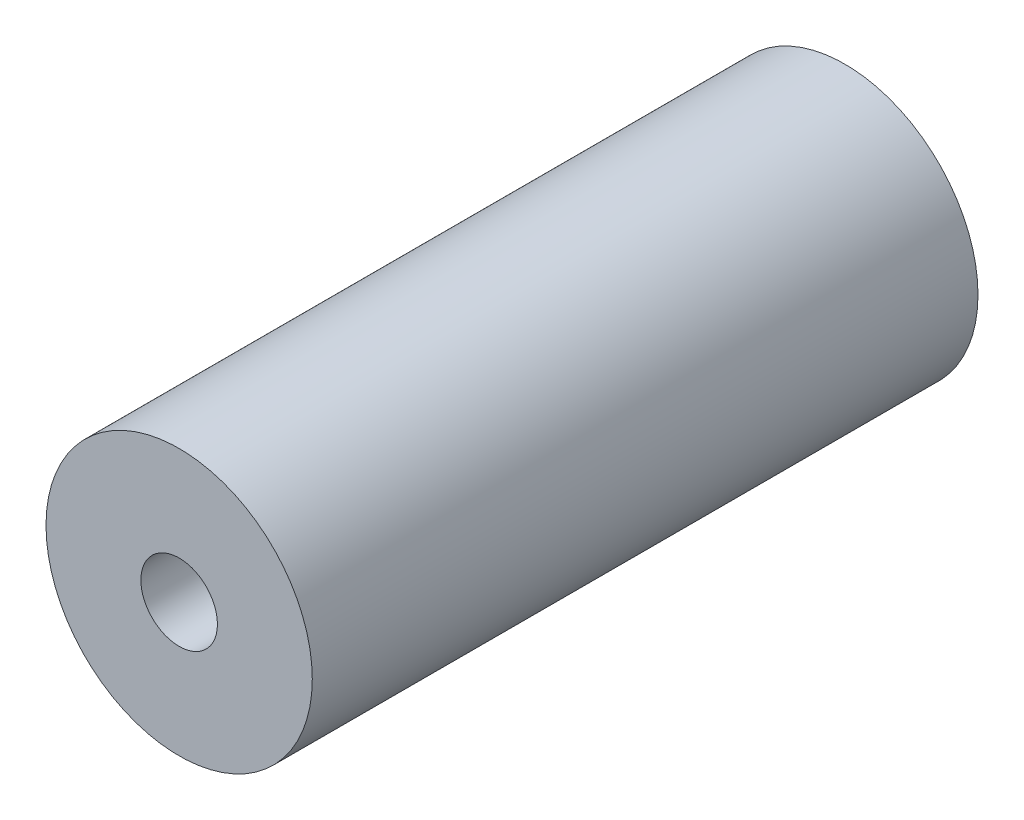
ISO-10303-21;
HEADER;
FILE_DESCRIPTION(('STEP AP214'),'2;1');
FILE_NAME('part.step','',(''),(''),'','','');
FILE_SCHEMA(('AUTOMOTIVE_DESIGN { 1 0 10303 214 1 1 1 1 }'));
ENDSEC;
DATA;
#1=APPLICATION_CONTEXT('core data for automotive mechanical design processes');
#2=APPLICATION_PROTOCOL_DEFINITION('international standard','automotive_design',2000,#1);
#3=PRODUCT_CONTEXT('',#1,'mechanical');
#4=PRODUCT('Part','Part','',(#3));
#5=PRODUCT_RELATED_PRODUCT_CATEGORY('part','',(#4));
#6=PRODUCT_DEFINITION_FORMATION('','',#4);
#7=PRODUCT_DEFINITION_CONTEXT('part definition',#1,'design');
#8=PRODUCT_DEFINITION('design','',#6,#7);
#9=PRODUCT_DEFINITION_SHAPE('','',#8);
#10=(LENGTH_UNIT() NAMED_UNIT(*) SI_UNIT(.MILLI.,.METRE.));
#11=(NAMED_UNIT(*) PLANE_ANGLE_UNIT() SI_UNIT($,.RADIAN.));
#12=(NAMED_UNIT(*) SI_UNIT($,.STERADIAN.) SOLID_ANGLE_UNIT());
#13=UNCERTAINTY_MEASURE_WITH_UNIT(LENGTH_MEASURE(1.E-05),#10,'distance_accuracy_value','');
#14=(GEOMETRIC_REPRESENTATION_CONTEXT(3) GLOBAL_UNCERTAINTY_ASSIGNED_CONTEXT((#13)) GLOBAL_UNIT_ASSIGNED_CONTEXT((#10,
#11,#12)) REPRESENTATION_CONTEXT('',''));
#15=CARTESIAN_POINT('',(0.,0.,0.));
#16=DIRECTION('',(0.,0.,1.));
#17=DIRECTION('',(1.,0.,0.));
#18=AXIS2_PLACEMENT_3D('',#15,#16,#17);
#19=CARTESIAN_POINT('',(0.,0.,20.));
#20=DIRECTION('',(0.,0.,1.));
#21=DIRECTION('',(1.,0.,0.));
#22=AXIS2_PLACEMENT_3D('',#19,#20,#21);
#23=PLANE('',#22);
#24=CARTESIAN_POINT('',(0.,0.,20.));
#25=DIRECTION('',(0.,0.,1.));
#26=DIRECTION('',(1.,0.,0.));
#27=AXIS2_PLACEMENT_3D('',#24,#25,#26);
#28=CIRCLE('',#27,4.);
#29=CARTESIAN_POINT('',(4.,0.,20.));
#30=VERTEX_POINT('',#29);
#31=EDGE_CURVE('E112',#30,#30,#28,.T.);
#32=ORIENTED_EDGE('',*,*,#31,.T.);
#33=EDGE_LOOP('',(#32));
#34=FACE_BOUND('',#33,.T.);
#35=CARTESIAN_POINT('',(0.,0.,20.));
#36=DIRECTION('',(0.,0.,1.));
#37=DIRECTION('',(1.,0.,0.));
#38=AXIS2_PLACEMENT_3D('',#35,#36,#37);
#39=CIRCLE('',#38,1.15);
#40=CARTESIAN_POINT('',(1.15,0.,20.));
#41=VERTEX_POINT('',#40);
#42=EDGE_CURVE('E106',#41,#41,#39,.T.);
#43=ORIENTED_EDGE('',*,*,#42,.F.);
#44=EDGE_LOOP('',(#43));
#45=FACE_BOUND('',#44,.T.);
#46=ADVANCED_FACE('F38',(#34,#45),#23,.T.);
#47=CARTESIAN_POINT('',(0.,0.,0.));
#48=DIRECTION('',(0.,0.,1.));
#49=DIRECTION('',(1.,0.,0.));
#50=AXIS2_PLACEMENT_3D('',#47,#48,#49);
#51=PLANE('',#50);
#52=CARTESIAN_POINT('',(0.,0.,0.));
#53=DIRECTION('',(0.,0.,1.));
#54=DIRECTION('',(1.,0.,0.));
#55=AXIS2_PLACEMENT_3D('',#52,#53,#54);
#56=CIRCLE('',#55,4.);
#57=CARTESIAN_POINT('',(4.,0.,0.));
#58=VERTEX_POINT('',#57);
#59=EDGE_CURVE('E109',#58,#58,#56,.T.);
#60=ORIENTED_EDGE('',*,*,#59,.F.);
#61=EDGE_LOOP('',(#60));
#62=FACE_BOUND('',#61,.T.);
#63=CARTESIAN_POINT('',(0.,0.,0.));
#64=DIRECTION('',(0.,0.,1.));
#65=DIRECTION('',(1.,0.,0.));
#66=AXIS2_PLACEMENT_3D('',#63,#64,#65);
#67=CIRCLE('',#66,1.15);
#68=CARTESIAN_POINT('',(1.15,0.,0.));
#69=VERTEX_POINT('',#68);
#70=EDGE_CURVE('E105',#69,#69,#67,.T.);
#71=ORIENTED_EDGE('',*,*,#70,.T.);
#72=EDGE_LOOP('',(#71));
#73=FACE_BOUND('',#72,.T.);
#74=ADVANCED_FACE('F119',(#62,#73),#51,.F.);
#75=CARTESIAN_POINT('',(0.,0.,20.));
#76=DIRECTION('',(0.,0.,-1.));
#77=DIRECTION('',(-1.,0.,0.));
#78=AXIS2_PLACEMENT_3D('',#75,#76,#77);
#79=CYLINDRICAL_SURFACE('',#78,4.);
#80=CARTESIAN_POINT('',(0.,-4.,9.75));
#81=CARTESIAN_POINT('',(0.0684391851745465,-3.99999965877989,9.74999955341243));
#82=CARTESIAN_POINT('',(0.136883052502859,-3.99822694984841,9.74436077305555));
#83=CARTESIAN_POINT('',(0.271769209588448,-3.99132894088807,9.72201375846077));
#84=CARTESIAN_POINT('',(0.338211042725907,-3.9862028819986,9.70530301863564));
#85=CARTESIAN_POINT('',(0.467128543650807,-3.97315815697909,9.66143062880426));
#86=CARTESIAN_POINT('',(0.529610176985804,-3.96524381499025,9.63428515534704));
#87=CARTESIAN_POINT('',(0.64913480234646,-3.94743969161093,9.57038268232167));
#88=CARTESIAN_POINT('',(0.706176935444885,-3.93754959899905,9.53362416821941));
#89=CARTESIAN_POINT('',(0.814965334952281,-3.91650213740282,9.45034400798264));
#90=CARTESIAN_POINT('',(0.86652002815666,-3.90531715926989,9.40357911493893));
#91=CARTESIAN_POINT('',(0.961197382036994,-3.88310046374208,9.30213160758645));
#92=CARTESIAN_POINT('',(1.0043184728987,-3.87206877523457,9.24744752250546));
#93=CARTESIAN_POINT('',(1.08194336483114,-3.85111144698172,9.13005543619192));
#94=CARTESIAN_POINT('',(1.11620784150129,-3.84121988301796,9.06718252247278));
#95=CARTESIAN_POINT('',(1.17359741076672,-3.82407801799234,8.93620768501813));
#96=CARTESIAN_POINT('',(1.19672543771945,-3.81682702128689,8.86810714420607));
#97=CARTESIAN_POINT('',(1.23048459930034,-3.80607606984501,8.73077192254794));
#98=CARTESIAN_POINT('',(1.24147110007865,-3.80246972929508,8.66163315636115));
#99=CARTESIAN_POINT('',(1.25174555036988,-3.7991005514095,8.52240688108811));
#100=CARTESIAN_POINT('',(1.25103660995772,-3.79933669227334,8.45231962917834));
#101=CARTESIAN_POINT('',(1.23821824732739,-3.80353189075438,8.31612553973102));
#102=CARTESIAN_POINT('',(1.22656057869383,-3.80734341745949,8.24997087413844));
#103=CARTESIAN_POINT('',(1.19290813355626,-3.81802025652489,8.12060784346266));
#104=CARTESIAN_POINT('',(1.17091225844551,-3.82488589343115,8.0573997922912));
#105=CARTESIAN_POINT('',(1.11688874681277,-3.84101044014297,7.93464805556737));
#106=CARTESIAN_POINT('',(1.08471925662082,-3.85030284660824,7.87517138930802));
#107=CARTESIAN_POINT('',(1.01136020737848,-3.8702185658007,7.76231223212088));
#108=CARTESIAN_POINT('',(0.970168305215774,-3.88084222394551,7.70893132974629));
#109=CARTESIAN_POINT('',(0.877716954182124,-3.90281527800493,7.60722505658301));
#110=CARTESIAN_POINT('',(0.826084570592818,-3.91417569605696,7.55924044222032));
#111=CARTESIAN_POINT('',(0.715364408095531,-3.9359157075958,7.47252810642032));
#112=CARTESIAN_POINT('',(0.656276077349021,-3.94629522838372,7.43380107078079));
#113=CARTESIAN_POINT('',(0.531664610465456,-3.96501294890191,7.36647231139873));
#114=CARTESIAN_POINT('',(0.466094906919281,-3.97333460648208,7.33795186453603));
#115=CARTESIAN_POINT('',(0.330767977782645,-3.98687955828554,7.29244699914843));
#116=CARTESIAN_POINT('',(0.26101203072461,-3.99210379325151,7.2754590777616));
#117=CARTESIAN_POINT('',(0.122185157290346,-3.99871389395014,7.25408195742102));
#118=CARTESIAN_POINT('',(0.0531918487888429,-4.00024022895439,7.24923145640648));
#119=CARTESIAN_POINT('',(-0.0846303057325844,-3.99969799730981,7.25096622663733));
#120=CARTESIAN_POINT('',(-0.153459174306505,-3.99762995581125,7.2575498273226));
#121=CARTESIAN_POINT('',(-0.287219332975851,-3.99022363769772,7.28159559260639));
#122=CARTESIAN_POINT('',(-0.352204978420948,-3.98496793110725,7.29878326761252));
#123=CARTESIAN_POINT('',(-0.478351928861365,-3.97180121379252,7.34321435236669));
#124=CARTESIAN_POINT('',(-0.539512760449016,-3.96388987514204,7.37045900402491));
#125=CARTESIAN_POINT('',(-0.657932406672232,-3.94598542759568,7.43497321654879));
#126=CARTESIAN_POINT('',(-0.715059739787955,-3.9359462681821,7.47247098749722));
#127=CARTESIAN_POINT('',(-0.822365850960096,-3.91493410002887,7.55615321011702));
#128=CARTESIAN_POINT('',(-0.872542738043336,-3.90396083845862,7.60234001774311));
#129=CARTESIAN_POINT('',(-0.966587462919657,-3.88176994885247,7.70425889005369));
#130=CARTESIAN_POINT('',(-1.01012652339774,-3.87055986714446,7.76029666374526));
#131=CARTESIAN_POINT('',(-1.08721250244909,-3.84961947087602,7.87912661637074));
#132=CARTESIAN_POINT('',(-1.12075957972524,-3.839889132814,7.94191868800443));
#133=CARTESIAN_POINT('',(-1.17670083481141,-3.82311782360754,8.07234517288586));
#134=CARTESIAN_POINT('',(-1.19913819558886,-3.81606646468027,8.1399596495047));
#135=CARTESIAN_POINT('',(-1.23222894320964,-3.80551170941212,8.2782724933238));
#136=CARTESIAN_POINT('',(-1.2428868141461,-3.80200696302675,8.34896967637131));
#137=CARTESIAN_POINT('',(-1.2517940615754,-3.79908292712494,8.48800408755424));
#138=CARTESIAN_POINT('',(-1.25058279621957,-3.79948604683077,8.55630345381293));
#139=CARTESIAN_POINT('',(-1.23708818129474,-3.80390090472383,8.69167458491918));
#140=CARTESIAN_POINT('',(-1.22480534822559,-3.80791247457319,8.758746406884));
#141=CARTESIAN_POINT('',(-1.18987729913378,-3.81896814158112,8.88879403960178));
#142=CARTESIAN_POINT('',(-1.16738642405944,-3.82596698183474,8.95181544109601));
#143=CARTESIAN_POINT('',(-1.11280227335064,-3.84219704261348,9.07324041353135));
#144=CARTESIAN_POINT('',(-1.08070704444254,-3.85142871716522,9.13164304207768));
#145=CARTESIAN_POINT('',(-1.00635675013475,-3.8715348703158,9.24464597044057));
#146=CARTESIAN_POINT('',(-0.963753335241275,-3.88245948922441,9.29900812950044));
#147=CARTESIAN_POINT('',(-0.87020899640485,-3.90448998821726,9.3999863281118));
#148=CARTESIAN_POINT('',(-0.819265842344404,-3.91559591606795,9.44660028899101));
#149=CARTESIAN_POINT('',(-0.708486662823334,-3.93717271952329,9.53228253836299));
#150=CARTESIAN_POINT('',(-0.648414574487381,-3.94761101730634,9.57105473644997));
#151=CARTESIAN_POINT('',(-0.522279138013655,-3.96626769296916,9.63789891513944));
#152=CARTESIAN_POINT('',(-0.45621815779545,-3.97448694315832,9.66597510214183));
#153=CARTESIAN_POINT('',(-0.325747635373979,-3.98720650733461,9.70859136760847));
#154=CARTESIAN_POINT('',(-0.261670337112546,-3.99196240806139,9.72407486730534));
#155=CARTESIAN_POINT('',(-0.131729895440248,-3.99835900340486,9.74477835996772));
#156=CARTESIAN_POINT('',(-0.0658671161396748,-4.00000032839644,9.75000042980401));
#157=CARTESIAN_POINT('',(0.,-4.,9.75));
#158=B_SPLINE_CURVE_WITH_KNOTS('',3,(#80,#81,#82,#83,#84,#85,#86,#87,#88,#89,#90,#91,#92,#93,
#94,#95,#96,#97,#98,#99,#100,#101,#102,#103,#104,#105,#106,#107,#108,#109,#110,#111,#112,#113,
#114,#115,#116,#117,#118,#119,#120,#121,#122,#123,#124,#125,#126,#127,#128,#129,#130,#131,#132,
#133,#134,#135,#136,#137,#138,#139,#140,#141,#142,#143,#144,#145,#146,#147,#148,#149,#150,#151,
#152,#153,#154,#155,#156,#157),.UNSPECIFIED.,.T.,.F.,(4,2,2,2,2,2,2,2,2,2,2,2,2,2,2,2,2,2,2,2,2,
2,2,2,2,2,2,2,2,2,2,2,2,2,2,2,2,2,4),(0.,0.20507544943251,0.410197323349067,0.615002479202437,
0.819839921558391,1.03037822195158,1.24095567431276,1.45673771247494,1.67246286279527,
1.8816915016721,2.09086450295138,2.29176917422169,2.49269519979063,2.69655642720545,
2.90047066010359,3.113667472796,3.32688007413303,3.5417546068977,3.75656384494554,
3.96307568548238,4.16955735649363,4.37090626722872,4.572280050345,4.77856324738344,
4.9849024570926,5.1994177871314,5.41392970983713,5.62760115751032,5.84119123892431,
6.04512203476054,6.24904331751085,6.44997913396671,6.65095584330174,6.85979514006362,
7.06869037373341,7.28440668126413,7.50003806666338,7.69744636651542,7.89481470763048),.UNSPECIFIED.);
#159=CARTESIAN_POINT('',(0.,-4.,9.75));
#160=VERTEX_POINT('',#159);
#161=EDGE_CURVE('E76',#160,#160,#158,.T.);
#162=ORIENTED_EDGE('',*,*,#161,.T.);
#163=EDGE_LOOP('',(#162));
#164=FACE_BOUND('',#163,.T.);
#165=ORIENTED_EDGE('',*,*,#31,.F.);
#166=EDGE_LOOP('',(#165));
#167=FACE_BOUND('',#166,.T.);
#168=ORIENTED_EDGE('',*,*,#59,.T.);
#169=EDGE_LOOP('',(#168));
#170=FACE_BOUND('',#169,.T.);
#171=ADVANCED_FACE('F40',(#164,#167,#170),#79,.T.);
#172=CARTESIAN_POINT('',(0.,0.,20.));
#173=DIRECTION('',(0.,0.,-1.));
#174=DIRECTION('',(-1.,0.,0.));
#175=AXIS2_PLACEMENT_3D('',#172,#173,#174);
#176=CYLINDRICAL_SURFACE('',#175,1.15);
#177=DIRECTION('',(0.,0.,-1.));
#178=VECTOR('',#177,1.);
#179=CARTESIAN_POINT('',(1.15,0.,20.));
#180=LINE('',#179,#178);
#181=CARTESIAN_POINT('',(1.15,0.,8.98989794855664));
#182=VERTEX_POINT('',#181);
#183=CARTESIAN_POINT('',(1.15,0.,8.01010205144336));
#184=VERTEX_POINT('',#183);
#185=EDGE_CURVE('E11',#182,#184,#180,.T.);
#186=ORIENTED_EDGE('',*,*,#185,.F.);
#187=CARTESIAN_POINT('',(-1.15,0.,8.98989794855664));
#188=CARTESIAN_POINT('',(-1.15003230162309,-0.032828237801573,8.9897382654906));
#189=CARTESIAN_POINT('',(-1.14859810003811,-0.0653347700604772,8.99320380605817));
#190=CARTESIAN_POINT('',(-1.14322458514487,-0.128443759257325,9.00556946049448));
#191=CARTESIAN_POINT('',(-1.13933656762532,-0.159071439232241,9.01435814848366));
#192=CARTESIAN_POINT('',(-1.12683647098247,-0.234289294796623,9.04133294493861));
#193=CARTESIAN_POINT('',(-1.11681297440976,-0.277682128254023,9.06203091716593));
#194=CARTESIAN_POINT('',(-1.09261490538421,-0.361402100309889,9.10776770774555));
#195=CARTESIAN_POINT('',(-1.0783903037426,-0.401684449163077,9.13285726525929));
#196=CARTESIAN_POINT('',(-1.04750194849557,-0.476151281024427,9.18266105963713));
#197=CARTESIAN_POINT('',(-1.03114544587839,-0.510563469589525,9.20722820408114));
#198=CARTESIAN_POINT('',(-0.99529386451245,-0.577344486527405,9.25685639969424));
#199=CARTESIAN_POINT('',(-0.975796599212964,-0.609711869322586,9.28191778420058));
#200=CARTESIAN_POINT('',(-0.912699166182251,-0.7036803243138,9.35656306073272));
#201=CARTESIAN_POINT('',(-0.864353113981404,-0.762483331100749,9.40584994470988));
#202=CARTESIAN_POINT('',(-0.768439291120295,-0.857510019761198,9.48737755231212));
#203=CARTESIAN_POINT('',(-0.723768849784717,-0.895682454558716,9.52077626628112));
#204=CARTESIAN_POINT('',(-0.626952972852965,-0.965916477227266,9.58292299830183));
#205=CARTESIAN_POINT('',(-0.574817410034118,-0.9979860078687,9.61167705377925));
#206=CARTESIAN_POINT('',(-0.474784316725464,-1.04859559591228,9.65735114445173));
#207=CARTESIAN_POINT('',(-0.428168647630975,-1.06856038978294,9.67548849663214));
#208=CARTESIAN_POINT('',(-0.331112172494996,-1.10249756527113,9.70642095693158));
#209=CARTESIAN_POINT('',(-0.280673941695573,-1.11647393975962,9.71921962454971));
#210=CARTESIAN_POINT('',(-0.176824701048578,-1.13756578342662,9.73856292747013));
#211=CARTESIAN_POINT('',(-0.123396114209745,-1.14463489156353,9.74506529993753));
#212=CARTESIAN_POINT('',(-0.0156884330338164,-1.15115592917222,9.7510628003066));
#213=CARTESIAN_POINT('',(0.0385902821829825,-1.15061116262871,9.7505609676315));
#214=CARTESIAN_POINT('',(0.140204798362124,-1.14243582353859,9.74304372335001));
#215=CARTESIAN_POINT('',(0.187659502907025,-1.13557357717964,9.73673460261749));
#216=CARTESIAN_POINT('',(0.280431377776177,-1.11629030143154,9.71905262918406));
#217=CARTESIAN_POINT('',(0.32574820573697,-1.10386838502451,9.70767896846229));
#218=CARTESIAN_POINT('',(0.415227757523052,-1.07350589040349,9.67998906645435));
#219=CARTESIAN_POINT('',(0.459257276667751,-1.05535116526508,9.66348149104992));
#220=CARTESIAN_POINT('',(0.543442847935885,-1.01457454942745,9.62662603146701));
#221=CARTESIAN_POINT('',(0.583596916659893,-0.991950389193199,9.60627619646029));
#222=CARTESIAN_POINT('',(0.679847753177998,-0.93009948506466,9.55109209880403));
#223=CARTESIAN_POINT('',(0.733222897553124,-0.888398746653727,9.51426876327335));
#224=CARTESIAN_POINT('',(0.830435242595803,-0.798306122842627,9.43636531738744));
#225=CARTESIAN_POINT('',(0.874246016092197,-0.749896287462003,9.39527386427976));
#226=CARTESIAN_POINT('',(0.953578555269277,-0.64619119886396,9.31032224948625));
#227=CARTESIAN_POINT('',(0.988874157786107,-0.590757707749109,9.26641915646012));
#228=CARTESIAN_POINT('',(1.03468306863591,-0.5030048704433,9.20187870290852));
#229=CARTESIAN_POINT('',(1.04876544764983,-0.472981215073384,9.18058066772958));
#230=CARTESIAN_POINT('',(1.0745105980592,-0.411156121938112,9.13915371507176));
#231=CARTESIAN_POINT('',(1.08617561533594,-0.379356369473929,9.11902372504095));
#232=CARTESIAN_POINT('',(1.10612286293759,-0.316226076534309,9.08257116989399));
#233=CARTESIAN_POINT('',(1.11460089750314,-0.285061023010798,9.0660729058053));
#234=CARTESIAN_POINT('',(1.12908827802428,-0.220764002946848,9.03658702884471));
#235=CARTESIAN_POINT('',(1.13511544410423,-0.18764831483189,9.02357431817509));
#236=CARTESIAN_POINT('',(1.14302028557413,-0.12889052110691,9.00603868989778));
#237=CARTESIAN_POINT('',(1.14558815243776,-0.103764586199686,9.00015748948882));
#238=CARTESIAN_POINT('',(1.1490991554967,-0.0524744427006517,8.9920168257074));
#239=CARTESIAN_POINT('',(1.15001880692975,-0.0263005770416327,8.98980974434214));
#240=CARTESIAN_POINT('',(1.15,0.,8.98989794855666));
#241=B_SPLINE_CURVE_WITH_KNOTS('',3,(#187,#188,#189,#190,#191,#192,#193,#194,#195,#196,#197,
#198,#199,#200,#201,#202,#203,#204,#205,#206,#207,#208,#209,#210,#211,#212,#213,#214,#215,#216,
#217,#218,#219,#220,#221,#222,#223,#224,#225,#226,#227,#228,#229,#230,#231,#232,#233,#234,#235,
#236,#237,#238,#239,#240),.UNSPECIFIED.,.F.,.F.,(4,2,2,2,2,2,2,2,2,2,2,2,2,2,2,2,2,2,2,2,2,2,2,
2,2,2,4),(0.,0.0977667277433921,0.193554473989682,0.340079422322608,0.488424924536772,
0.62424823966931,0.760166524847265,1.03070684962237,1.23280444625299,1.43463719185703,
1.5955727576817,1.75640084961617,1.91830114025616,2.08013117764234,2.22455759793391,
2.36900706896548,2.51966178505397,2.67039319967646,2.90039681956287,3.13102813370816,
3.36723877216905,3.48538510142629,3.60342116827128,3.71202699658971,3.81982839619659,
3.89732406117553,3.97591540767071),.UNSPECIFIED.);
#242=CARTESIAN_POINT('',(-1.15,0.,8.98989794855664));
#243=VERTEX_POINT('',#242);
#244=EDGE_CURVE('E65',#243,#182,#241,.T.);
#245=ORIENTED_EDGE('',*,*,#244,.F.);
#246=DIRECTION('',(0.,0.,-1.));
#247=VECTOR('',#246,1.);
#248=CARTESIAN_POINT('',(-1.15,0.,20.));
#249=LINE('',#248,#247);
#250=CARTESIAN_POINT('',(-1.15,0.,8.01010205144336));
#251=VERTEX_POINT('',#250);
#252=EDGE_CURVE('E57',#251,#243,#249,.F.);
#253=ORIENTED_EDGE('',*,*,#252,.F.);
#254=CARTESIAN_POINT('',(1.15,0.,8.01010205144336));
#255=CARTESIAN_POINT('',(1.15003230162309,-0.0328282378015729,8.01026173450941));
#256=CARTESIAN_POINT('',(1.14859810003811,-0.0653347700604772,8.00679619394184));
#257=CARTESIAN_POINT('',(1.14322458514487,-0.128443759257325,7.99443053950552));
#258=CARTESIAN_POINT('',(1.13933656762532,-0.159071439232241,7.98564185151634));
#259=CARTESIAN_POINT('',(1.12683647098247,-0.234289294796623,7.9586670550614));
#260=CARTESIAN_POINT('',(1.11681297440976,-0.277682128254022,7.93796908283407));
#261=CARTESIAN_POINT('',(1.09261490538421,-0.361402100309889,7.89223229225445));
#262=CARTESIAN_POINT('',(1.0783903037426,-0.401684449163077,7.86714273474071));
#263=CARTESIAN_POINT('',(1.04750194849557,-0.476151281024427,7.81733894036287));
#264=CARTESIAN_POINT('',(1.03114544587839,-0.510563469589525,7.79277179591886));
#265=CARTESIAN_POINT('',(0.99529386451245,-0.577344486527405,7.74314360030576));
#266=CARTESIAN_POINT('',(0.975796599212964,-0.609711869322586,7.71808221579942));
#267=CARTESIAN_POINT('',(0.912699166182251,-0.7036803243138,7.64343693926728));
#268=CARTESIAN_POINT('',(0.864353113981403,-0.762483331100749,7.59415005529012));
#269=CARTESIAN_POINT('',(0.768439291120295,-0.857510019761198,7.51262244768788));
#270=CARTESIAN_POINT('',(0.723768849784716,-0.895682454558717,7.47922373371888));
#271=CARTESIAN_POINT('',(0.626952972852965,-0.965916477227266,7.41707700169817));
#272=CARTESIAN_POINT('',(0.574817410034118,-0.997986007868701,7.38832294622075));
#273=CARTESIAN_POINT('',(0.474784316725464,-1.04859559591228,7.34264885554827));
#274=CARTESIAN_POINT('',(0.428168647630976,-1.06856038978294,7.32451150336786));
#275=CARTESIAN_POINT('',(0.331112172494997,-1.10249756527113,7.29357904306842));
#276=CARTESIAN_POINT('',(0.280673941695574,-1.11647393975962,7.28078037545029));
#277=CARTESIAN_POINT('',(0.176824701048579,-1.13756578342662,7.26143707252987));
#278=CARTESIAN_POINT('',(0.123396114209746,-1.14463489156353,7.25493470006246));
#279=CARTESIAN_POINT('',(0.0156884330338174,-1.15115592917222,7.2489371996934));
#280=CARTESIAN_POINT('',(-0.0385902821829815,-1.15061116262871,7.2494390323685));
#281=CARTESIAN_POINT('',(-0.140204798362123,-1.14243582353859,7.25695627665));
#282=CARTESIAN_POINT('',(-0.187659502907024,-1.13557357717964,7.26326539738251));
#283=CARTESIAN_POINT('',(-0.280431377776176,-1.11629030143154,7.28094737081595));
#284=CARTESIAN_POINT('',(-0.325748205736969,-1.10386838502451,7.29232103153771));
#285=CARTESIAN_POINT('',(-0.41522775752305,-1.07350589040349,7.32001093354565));
#286=CARTESIAN_POINT('',(-0.45925727666775,-1.05535116526508,7.33651850895009));
#287=CARTESIAN_POINT('',(-0.543442847935884,-1.01457454942745,7.37337396853299));
#288=CARTESIAN_POINT('',(-0.583596916659892,-0.9919503891932,7.39372380353971));
#289=CARTESIAN_POINT('',(-0.679847753177998,-0.93009948506466,7.44890790119597));
#290=CARTESIAN_POINT('',(-0.733222897553123,-0.888398746653728,7.48573123672665));
#291=CARTESIAN_POINT('',(-0.830435242595802,-0.798306122842628,7.56363468261256));
#292=CARTESIAN_POINT('',(-0.874246016092196,-0.749896287462004,7.60472613572024));
#293=CARTESIAN_POINT('',(-0.953578555269276,-0.646191198863962,7.68967775051375));
#294=CARTESIAN_POINT('',(-0.988874157786106,-0.590757707749111,7.73358084353988));
#295=CARTESIAN_POINT('',(-1.03468306863591,-0.503004870443302,7.79812129709148));
#296=CARTESIAN_POINT('',(-1.04876544764983,-0.472981215073386,7.81941933227042));
#297=CARTESIAN_POINT('',(-1.0745105980592,-0.411156121938115,7.86084628492824));
#298=CARTESIAN_POINT('',(-1.08617561533594,-0.379356369473932,7.88097627495905));
#299=CARTESIAN_POINT('',(-1.10612286293758,-0.316226076534312,7.91742883010601));
#300=CARTESIAN_POINT('',(-1.11460089750314,-0.285061023010801,7.9339270941947));
#301=CARTESIAN_POINT('',(-1.12908827802428,-0.22076400294685,7.96341297115529));
#302=CARTESIAN_POINT('',(-1.13511544410423,-0.187648314831892,7.97642568182491));
#303=CARTESIAN_POINT('',(-1.14302028557413,-0.128890521106912,7.99396131010222));
#304=CARTESIAN_POINT('',(-1.14558815243776,-0.103764586199688,7.99984251051118));
#305=CARTESIAN_POINT('',(-1.1490991554967,-0.0524744427006532,8.0079831742926));
#306=CARTESIAN_POINT('',(-1.15001880692975,-0.0263005770416337,8.01019025565786));
#307=CARTESIAN_POINT('',(-1.15,0.,8.01010205144334));
#308=B_SPLINE_CURVE_WITH_KNOTS('',3,(#254,#255,#256,#257,#258,#259,#260,#261,#262,#263,#264,
#265,#266,#267,#268,#269,#270,#271,#272,#273,#274,#275,#276,#277,#278,#279,#280,#281,#282,#283,
#284,#285,#286,#287,#288,#289,#290,#291,#292,#293,#294,#295,#296,#297,#298,#299,#300,#301,#302,
#303,#304,#305,#306,#307),.UNSPECIFIED.,.F.,.F.,(4,2,2,2,2,2,2,2,2,2,2,2,2,2,2,2,2,2,2,2,2,2,2,
2,2,2,4),(0.,0.0977667277433922,0.193554473989682,0.340079422322608,0.488424924536772,
0.62424823966931,0.760166524847265,1.03070684962237,1.23280444625299,1.43463719185703,
1.5955727576817,1.75640084961617,1.91830114025615,2.08013117764234,2.22455759793391,
2.36900706896548,2.51966178505397,2.67039319967646,2.90039681956287,3.13102813370816,
3.36723877216904,3.48538510142629,3.60342116827128,3.7120269965897,3.81982839619659,
3.89732406117553,3.97591540767071),.UNSPECIFIED.);
#309=EDGE_CURVE('E47',#184,#251,#308,.T.);
#310=ORIENTED_EDGE('',*,*,#309,.F.);
#311=EDGE_LOOP('',(#186,#245,#253,#310));
#312=FACE_BOUND('',#311,.T.);
#313=ORIENTED_EDGE('',*,*,#42,.T.);
#314=EDGE_LOOP('',(#313));
#315=FACE_BOUND('',#314,.T.);
#316=ORIENTED_EDGE('',*,*,#70,.F.);
#317=EDGE_LOOP('',(#316));
#318=FACE_BOUND('',#317,.T.);
#319=ADVANCED_FACE('F78',(#312,#315,#318),#176,.F.);
#320=CARTESIAN_POINT('',(0.,-10.,8.5));
#321=DIRECTION('',(0.,1.,0.));
#322=DIRECTION('',(0.,0.,1.));
#323=AXIS2_PLACEMENT_3D('',#320,#321,#322);
#324=CYLINDRICAL_SURFACE('',#323,1.25);
#325=ORIENTED_EDGE('',*,*,#309,.T.);
#326=CARTESIAN_POINT('',(0.,0.,8.5));
#327=DIRECTION('',(0.,1.,0.));
#328=DIRECTION('',(0.,0.,1.));
#329=AXIS2_PLACEMENT_3D('',#326,#327,#328);
#330=CIRCLE('',#329,1.25);
#331=EDGE_CURVE('E53',#251,#243,#330,.T.);
#332=ORIENTED_EDGE('',*,*,#331,.T.);
#333=ORIENTED_EDGE('',*,*,#244,.T.);
#334=EDGE_CURVE('E69',#182,#184,#330,.T.);
#335=ORIENTED_EDGE('',*,*,#334,.T.);
#336=EDGE_LOOP('',(#325,#332,#333,#335));
#337=FACE_BOUND('',#336,.T.);
#338=ORIENTED_EDGE('',*,*,#161,.F.);
#339=EDGE_LOOP('',(#338));
#340=FACE_BOUND('',#339,.T.);
#341=ADVANCED_FACE('F67',(#337,#340),#324,.F.);
#342=CARTESIAN_POINT('',(0.,0.,8.5));
#343=DIRECTION('',(0.,1.,0.));
#344=DIRECTION('',(0.,0.,1.));
#345=AXIS2_PLACEMENT_3D('',#342,#343,#344);
#346=PLANE('',#345);
#347=ORIENTED_EDGE('',*,*,#185,.T.);
#348=ORIENTED_EDGE('',*,*,#334,.F.);
#349=EDGE_LOOP('',(#347,#348));
#350=FACE_BOUND('',#349,.T.);
#351=ADVANCED_FACE('F75',(#350),#346,.F.);
#352=ORIENTED_EDGE('',*,*,#252,.T.);
#353=ORIENTED_EDGE('',*,*,#331,.F.);
#354=EDGE_LOOP('',(#352,#353));
#355=FACE_BOUND('',#354,.T.);
#356=ADVANCED_FACE('F96',(#355),#346,.F.);
#357=CLOSED_SHELL('',(#46,#74,#171,#319,#341,#351,#356));
#358=MANIFOLD_SOLID_BREP('B2',#357);
#359=ADVANCED_BREP_SHAPE_REPRESENTATION('',(#18,#358),#14);
#360=SHAPE_DEFINITION_REPRESENTATION(#9,#359);
ENDSEC;
END-ISO-10303-21;
